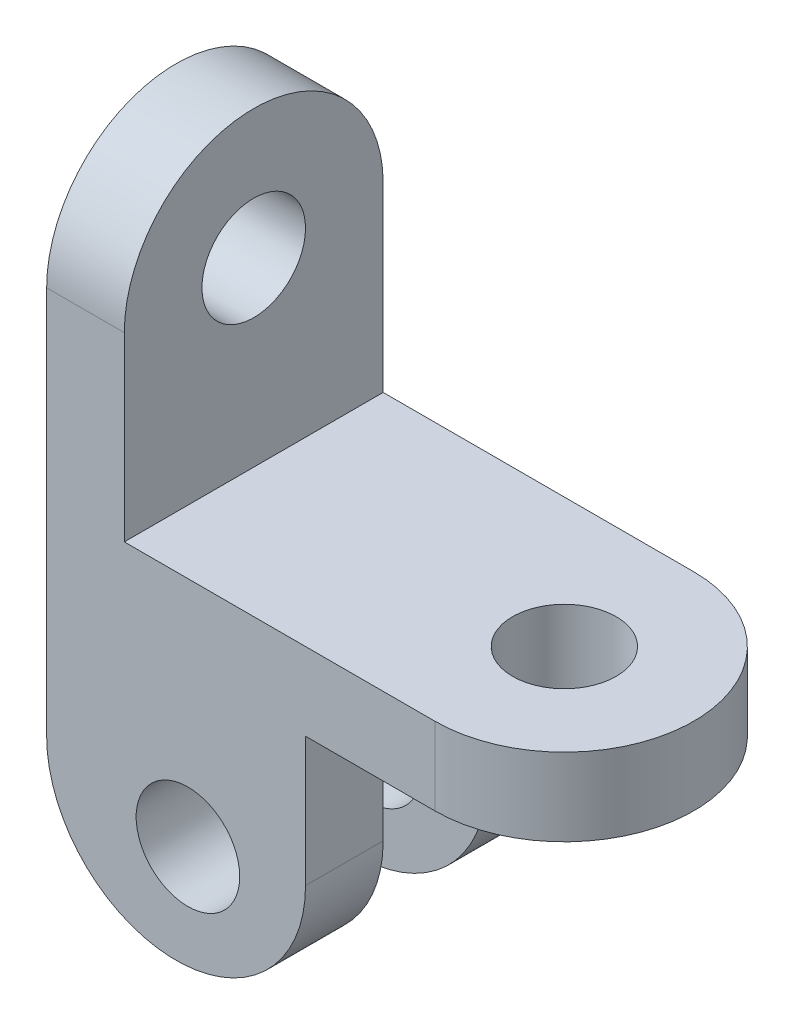
ISO-10303-21;
HEADER;
FILE_DESCRIPTION(('STEP AP214'),'2;1');
FILE_NAME('part.step','',(''),(''),'','','');
FILE_SCHEMA(('AUTOMOTIVE_DESIGN { 1 0 10303 214 1 1 1 1 }'));
ENDSEC;
DATA;
#1=APPLICATION_CONTEXT('core data for automotive mechanical design processes');
#2=APPLICATION_PROTOCOL_DEFINITION('international standard','automotive_design',2000,#1);
#3=PRODUCT_CONTEXT('',#1,'mechanical');
#4=PRODUCT('Part','Part','',(#3));
#5=PRODUCT_RELATED_PRODUCT_CATEGORY('part','',(#4));
#6=PRODUCT_DEFINITION_FORMATION('','',#4);
#7=PRODUCT_DEFINITION_CONTEXT('part definition',#1,'design');
#8=PRODUCT_DEFINITION('design','',#6,#7);
#9=PRODUCT_DEFINITION_SHAPE('','',#8);
#10=(LENGTH_UNIT() NAMED_UNIT(*) SI_UNIT(.MILLI.,.METRE.));
#11=(NAMED_UNIT(*) PLANE_ANGLE_UNIT() SI_UNIT($,.RADIAN.));
#12=(NAMED_UNIT(*) SI_UNIT($,.STERADIAN.) SOLID_ANGLE_UNIT());
#13=UNCERTAINTY_MEASURE_WITH_UNIT(LENGTH_MEASURE(1.E-05),#10,'distance_accuracy_value','');
#14=(GEOMETRIC_REPRESENTATION_CONTEXT(3) GLOBAL_UNCERTAINTY_ASSIGNED_CONTEXT((#13)) GLOBAL_UNIT_ASSIGNED_CONTEXT((#10,
#11,#12)) REPRESENTATION_CONTEXT('',''));
#15=CARTESIAN_POINT('',(0.,0.,0.));
#16=DIRECTION('',(0.,0.,1.));
#17=DIRECTION('',(1.,0.,0.));
#18=AXIS2_PLACEMENT_3D('',#15,#16,#17);
#19=CARTESIAN_POINT('',(0.,0.,0.));
#20=DIRECTION('',(0.,1.,0.));
#21=DIRECTION('',(0.,0.,1.));
#22=AXIS2_PLACEMENT_3D('',#19,#20,#21);
#23=PLANE('',#22);
#24=CARTESIAN_POINT('',(0.,0.,0.));
#25=DIRECTION('',(0.,1.,0.));
#26=DIRECTION('',(0.,0.,1.));
#27=AXIS2_PLACEMENT_3D('',#24,#25,#26);
#28=CIRCLE('',#27,8.);
#29=CARTESIAN_POINT('',(0.,0.,8.));
#30=VERTEX_POINT('',#29);
#31=EDGE_CURVE('E210',#30,#30,#28,.T.);
#32=ORIENTED_EDGE('',*,*,#31,.T.);
#33=EDGE_LOOP('',(#32));
#34=FACE_BOUND('',#33,.T.);
#35=DIRECTION('',(-1.,0.,0.));
#36=VECTOR('',#35,1.);
#37=CARTESIAN_POINT('',(-60.,0.,-8.));
#38=LINE('',#37,#36);
#39=CARTESIAN_POINT('',(-20.,0.,-8.));
#40=VERTEX_POINT('',#39);
#41=CARTESIAN_POINT('',(-60.,0.,-8.));
#42=VERTEX_POINT('',#41);
#43=EDGE_CURVE('E49',#40,#42,#38,.T.);
#44=ORIENTED_EDGE('',*,*,#43,.F.);
#45=DIRECTION('',(0.,0.,1.));
#46=VECTOR('',#45,1.);
#47=CARTESIAN_POINT('',(-20.,0.,-20.));
#48=LINE('',#47,#46);
#49=CARTESIAN_POINT('',(-20.,0.,-20.));
#50=VERTEX_POINT('',#49);
#51=EDGE_CURVE('E159',#50,#40,#48,.T.);
#52=ORIENTED_EDGE('',*,*,#51,.F.);
#53=DIRECTION('',(-1.,0.,0.));
#54=VECTOR('',#53,1.);
#55=CARTESIAN_POINT('',(0.,0.,-20.));
#56=LINE('',#55,#54);
#57=CARTESIAN_POINT('',(0.,0.,-20.));
#58=VERTEX_POINT('',#57);
#59=EDGE_CURVE('E228',#58,#50,#56,.T.);
#60=ORIENTED_EDGE('',*,*,#59,.F.);
#61=CARTESIAN_POINT('',(0.,0.,0.));
#62=DIRECTION('',(0.,1.,0.));
#63=DIRECTION('',(0.,0.,1.));
#64=AXIS2_PLACEMENT_3D('',#61,#62,#63);
#65=CIRCLE('',#64,20.);
#66=CARTESIAN_POINT('',(0.,0.,20.));
#67=VERTEX_POINT('',#66);
#68=EDGE_CURVE('E213',#67,#58,#65,.T.);
#69=ORIENTED_EDGE('',*,*,#68,.F.);
#70=DIRECTION('',(1.,0.,0.));
#71=VECTOR('',#70,1.);
#72=CARTESIAN_POINT('',(0.,0.,20.));
#73=LINE('',#72,#71);
#74=CARTESIAN_POINT('',(-20.,0.,20.));
#75=VERTEX_POINT('',#74);
#76=EDGE_CURVE('E220',#75,#67,#73,.T.);
#77=ORIENTED_EDGE('',*,*,#76,.F.);
#78=DIRECTION('',(0.,0.,1.));
#79=VECTOR('',#78,1.);
#80=CARTESIAN_POINT('',(-20.,0.,8.));
#81=LINE('',#80,#79);
#82=CARTESIAN_POINT('',(-20.,0.,8.));
#83=VERTEX_POINT('',#82);
#84=EDGE_CURVE('E179',#83,#75,#81,.T.);
#85=ORIENTED_EDGE('',*,*,#84,.F.);
#86=DIRECTION('',(-1.,0.,0.));
#87=VECTOR('',#86,1.);
#88=CARTESIAN_POINT('',(-60.,0.,8.));
#89=LINE('',#88,#87);
#90=CARTESIAN_POINT('',(-60.,0.,8.));
#91=VERTEX_POINT('',#90);
#92=EDGE_CURVE('E171',#83,#91,#89,.T.);
#93=ORIENTED_EDGE('',*,*,#92,.T.);
#94=DIRECTION('',(0.,0.,1.));
#95=VECTOR('',#94,1.);
#96=CARTESIAN_POINT('',(-60.,0.,-20.));
#97=LINE('',#96,#95);
#98=EDGE_CURVE('E56',#42,#91,#97,.T.);
#99=ORIENTED_EDGE('',*,*,#98,.F.);
#100=EDGE_LOOP('',(#44,#52,#60,#69,#77,#85,#93,#99));
#101=FACE_BOUND('',#100,.T.);
#102=ADVANCED_FACE('F33',(#34,#101),#23,.F.);
#103=CARTESIAN_POINT('',(0.,12.,0.));
#104=DIRECTION('',(0.,1.,0.));
#105=DIRECTION('',(0.,0.,1.));
#106=AXIS2_PLACEMENT_3D('',#103,#104,#105);
#107=PLANE('',#106);
#108=CARTESIAN_POINT('',(0.,12.,0.));
#109=DIRECTION('',(0.,1.,0.));
#110=DIRECTION('',(0.,0.,1.));
#111=AXIS2_PLACEMENT_3D('',#108,#109,#110);
#112=CIRCLE('',#111,8.);
#113=CARTESIAN_POINT('',(0.,12.,8.));
#114=VERTEX_POINT('',#113);
#115=EDGE_CURVE('E207',#114,#114,#112,.T.);
#116=ORIENTED_EDGE('',*,*,#115,.F.);
#117=EDGE_LOOP('',(#116));
#118=FACE_BOUND('',#117,.T.);
#119=DIRECTION('',(-1.,0.,0.));
#120=VECTOR('',#119,1.);
#121=CARTESIAN_POINT('',(0.,12.,-20.));
#122=LINE('',#121,#120);
#123=CARTESIAN_POINT('',(0.,12.,-20.));
#124=VERTEX_POINT('',#123);
#125=CARTESIAN_POINT('',(-48.,12.,-20.));
#126=VERTEX_POINT('',#125);
#127=EDGE_CURVE('E219',#124,#126,#122,.T.);
#128=ORIENTED_EDGE('',*,*,#127,.T.);
#129=DIRECTION('',(0.,0.,1.));
#130=VECTOR('',#129,1.);
#131=CARTESIAN_POINT('',(-48.,12.,-20.));
#132=LINE('',#131,#130);
#133=CARTESIAN_POINT('',(-48.,12.,20.));
#134=VERTEX_POINT('',#133);
#135=EDGE_CURVE('E194',#126,#134,#132,.T.);
#136=ORIENTED_EDGE('',*,*,#135,.T.);
#137=DIRECTION('',(1.,0.,0.));
#138=VECTOR('',#137,1.);
#139=CARTESIAN_POINT('',(0.,12.,20.));
#140=LINE('',#139,#138);
#141=CARTESIAN_POINT('',(0.,12.,20.));
#142=VERTEX_POINT('',#141);
#143=EDGE_CURVE('E223',#134,#142,#140,.T.);
#144=ORIENTED_EDGE('',*,*,#143,.T.);
#145=CARTESIAN_POINT('',(0.,12.,0.));
#146=DIRECTION('',(0.,1.,0.));
#147=DIRECTION('',(0.,0.,1.));
#148=AXIS2_PLACEMENT_3D('',#145,#146,#147);
#149=CIRCLE('',#148,20.);
#150=EDGE_CURVE('E216',#142,#124,#149,.T.);
#151=ORIENTED_EDGE('',*,*,#150,.T.);
#152=EDGE_LOOP('',(#128,#136,#144,#151));
#153=FACE_BOUND('',#152,.T.);
#154=ADVANCED_FACE('F256',(#118,#153),#107,.T.);
#155=CARTESIAN_POINT('',(0.,12.,0.));
#156=DIRECTION('',(0.,-1.,0.));
#157=DIRECTION('',(0.,0.,-1.));
#158=AXIS2_PLACEMENT_3D('',#155,#156,#157);
#159=CYLINDRICAL_SURFACE('',#158,20.);
#160=ORIENTED_EDGE('',*,*,#68,.T.);
#161=DIRECTION('',(0.,-1.,0.));
#162=VECTOR('',#161,1.);
#163=CARTESIAN_POINT('',(0.,12.,-20.));
#164=LINE('',#163,#162);
#165=EDGE_CURVE('E11',#124,#58,#164,.T.);
#166=ORIENTED_EDGE('',*,*,#165,.F.);
#167=ORIENTED_EDGE('',*,*,#150,.F.);
#168=DIRECTION('',(0.,-1.,0.));
#169=VECTOR('',#168,1.);
#170=CARTESIAN_POINT('',(0.,12.,20.));
#171=LINE('',#170,#169);
#172=EDGE_CURVE('E225',#142,#67,#171,.T.);
#173=ORIENTED_EDGE('',*,*,#172,.T.);
#174=EDGE_LOOP('',(#160,#166,#167,#173));
#175=FACE_BOUND('',#174,.T.);
#176=ADVANCED_FACE('F35',(#175),#159,.T.);
#177=CARTESIAN_POINT('',(0.,12.,-20.));
#178=DIRECTION('',(0.,0.,1.));
#179=DIRECTION('',(1.,0.,0.));
#180=AXIS2_PLACEMENT_3D('',#177,#178,#179);
#181=PLANE('',#180);
#182=CARTESIAN_POINT('',(-38.1692293499623,-23.8807713065157,-20.));
#183=DIRECTION('',(0.,0.,1.));
#184=DIRECTION('',(1.,0.,0.));
#185=AXIS2_PLACEMENT_3D('',#182,#183,#184);
#186=CIRCLE('',#185,8.);
#187=CARTESIAN_POINT('',(-30.1692293499623,-23.8807713065157,-20.));
#188=VERTEX_POINT('',#187);
#189=EDGE_CURVE('E295',#188,#188,#186,.T.);
#190=ORIENTED_EDGE('',*,*,#189,.T.);
#191=EDGE_LOOP('',(#190));
#192=FACE_BOUND('',#191,.T.);
#193=ORIENTED_EDGE('',*,*,#59,.T.);
#194=DIRECTION('',(0.,1.,0.));
#195=VECTOR('',#194,1.);
#196=CARTESIAN_POINT('',(-20.,0.,-20.));
#197=LINE('',#196,#195);
#198=CARTESIAN_POINT('',(-20.,-20.,-20.));
#199=VERTEX_POINT('',#198);
#200=EDGE_CURVE('E142',#199,#50,#197,.T.);
#201=ORIENTED_EDGE('',*,*,#200,.F.);
#202=CARTESIAN_POINT('',(-40.,-20.,-20.));
#203=DIRECTION('',(0.,0.,1.));
#204=DIRECTION('',(1.,0.,0.));
#205=AXIS2_PLACEMENT_3D('',#202,#203,#204);
#206=CIRCLE('',#205,20.);
#207=CARTESIAN_POINT('',(-60.,-20.,-20.));
#208=VERTEX_POINT('',#207);
#209=EDGE_CURVE('E138',#208,#199,#206,.T.);
#210=ORIENTED_EDGE('',*,*,#209,.F.);
#211=DIRECTION('',(0.,-1.,0.));
#212=VECTOR('',#211,1.);
#213=CARTESIAN_POINT('',(-60.,12.,-20.));
#214=LINE('',#213,#212);
#215=CARTESIAN_POINT('',(-60.,40.,-20.));
#216=VERTEX_POINT('',#215);
#217=EDGE_CURVE('E42',#216,#208,#214,.T.);
#218=ORIENTED_EDGE('',*,*,#217,.F.);
#219=DIRECTION('',(-1.,0.,0.));
#220=VECTOR('',#219,1.);
#221=CARTESIAN_POINT('',(-48.,40.,-20.));
#222=LINE('',#221,#220);
#223=CARTESIAN_POINT('',(-48.,40.,-20.));
#224=VERTEX_POINT('',#223);
#225=EDGE_CURVE('E205',#224,#216,#222,.T.);
#226=ORIENTED_EDGE('',*,*,#225,.F.);
#227=DIRECTION('',(0.,-1.,0.));
#228=VECTOR('',#227,1.);
#229=CARTESIAN_POINT('',(-48.,12.,-20.));
#230=LINE('',#229,#228);
#231=EDGE_CURVE('E191',#224,#126,#230,.T.);
#232=ORIENTED_EDGE('',*,*,#231,.T.);
#233=ORIENTED_EDGE('',*,*,#127,.F.);
#234=ORIENTED_EDGE('',*,*,#165,.T.);
#235=EDGE_LOOP('',(#193,#201,#210,#218,#226,#232,#233,#234));
#236=FACE_BOUND('',#235,.T.);
#237=ADVANCED_FACE('F146',(#192,#236),#181,.F.);
#238=CARTESIAN_POINT('',(-60.,12.,-20.));
#239=DIRECTION('',(1.,0.,0.));
#240=DIRECTION('',(0.,0.,-1.));
#241=AXIS2_PLACEMENT_3D('',#238,#239,#240);
#242=PLANE('',#241);
#243=CARTESIAN_POINT('',(-60.,40.,0.));
#244=DIRECTION('',(1.,0.,0.));
#245=DIRECTION('',(0.,0.,-1.));
#246=AXIS2_PLACEMENT_3D('',#243,#244,#245);
#247=CIRCLE('',#246,8.);
#248=CARTESIAN_POINT('',(-60.,40.,-8.));
#249=VERTEX_POINT('',#248);
#250=EDGE_CURVE('E186',#249,#249,#247,.T.);
#251=ORIENTED_EDGE('',*,*,#250,.T.);
#252=EDGE_LOOP('',(#251));
#253=FACE_BOUND('',#252,.T.);
#254=ORIENTED_EDGE('',*,*,#217,.T.);
#255=DIRECTION('',(0.,0.,1.));
#256=VECTOR('',#255,1.);
#257=CARTESIAN_POINT('',(-60.,-20.,-20.));
#258=LINE('',#257,#256);
#259=CARTESIAN_POINT('',(-60.,-20.,-8.));
#260=VERTEX_POINT('',#259);
#261=EDGE_CURVE('E126',#208,#260,#258,.T.);
#262=ORIENTED_EDGE('',*,*,#261,.T.);
#263=DIRECTION('',(0.,-1.,0.));
#264=VECTOR('',#263,1.);
#265=CARTESIAN_POINT('',(-60.,0.,-8.));
#266=LINE('',#265,#264);
#267=EDGE_CURVE('E155',#42,#260,#266,.T.);
#268=ORIENTED_EDGE('',*,*,#267,.F.);
#269=ORIENTED_EDGE('',*,*,#98,.T.);
#270=DIRECTION('',(0.,-1.,0.));
#271=VECTOR('',#270,1.);
#272=CARTESIAN_POINT('',(-60.,0.,8.));
#273=LINE('',#272,#271);
#274=CARTESIAN_POINT('',(-60.,-20.,8.));
#275=VERTEX_POINT('',#274);
#276=EDGE_CURVE('E163',#91,#275,#273,.T.);
#277=ORIENTED_EDGE('',*,*,#276,.T.);
#278=DIRECTION('',(0.,0.,1.));
#279=VECTOR('',#278,1.);
#280=CARTESIAN_POINT('',(-60.,-20.,8.));
#281=LINE('',#280,#279);
#282=CARTESIAN_POINT('',(-60.,-20.,20.));
#283=VERTEX_POINT('',#282);
#284=EDGE_CURVE('E174',#275,#283,#281,.T.);
#285=ORIENTED_EDGE('',*,*,#284,.T.);
#286=DIRECTION('',(0.,-1.,0.));
#287=VECTOR('',#286,1.);
#288=CARTESIAN_POINT('',(-60.,12.,20.));
#289=LINE('',#288,#287);
#290=CARTESIAN_POINT('',(-60.,40.,20.));
#291=VERTEX_POINT('',#290);
#292=EDGE_CURVE('E133',#291,#283,#289,.T.);
#293=ORIENTED_EDGE('',*,*,#292,.F.);
#294=CARTESIAN_POINT('',(-60.,40.,0.));
#295=DIRECTION('',(-1.,0.,0.));
#296=DIRECTION('',(0.,0.,1.));
#297=AXIS2_PLACEMENT_3D('',#294,#295,#296);
#298=CIRCLE('',#297,20.);
#299=EDGE_CURVE('E129',#291,#216,#298,.T.);
#300=ORIENTED_EDGE('',*,*,#299,.T.);
#301=EDGE_LOOP('',(#254,#262,#268,#269,#277,#285,#293,#300));
#302=FACE_BOUND('',#301,.T.);
#303=ADVANCED_FACE('F125',(#253,#302),#242,.F.);
#304=CARTESIAN_POINT('',(0.,12.,20.));
#305=DIRECTION('',(0.,0.,-1.));
#306=DIRECTION('',(-1.,0.,0.));
#307=AXIS2_PLACEMENT_3D('',#304,#305,#306);
#308=PLANE('',#307);
#309=CARTESIAN_POINT('',(-38.1692293499623,-23.8807713065157,20.));
#310=DIRECTION('',(0.,0.,1.));
#311=DIRECTION('',(1.,0.,0.));
#312=AXIS2_PLACEMENT_3D('',#309,#310,#311);
#313=CIRCLE('',#312,8.);
#314=CARTESIAN_POINT('',(-30.1692293499623,-23.8807713065157,20.));
#315=VERTEX_POINT('',#314);
#316=EDGE_CURVE('E297',#315,#315,#313,.T.);
#317=ORIENTED_EDGE('',*,*,#316,.F.);
#318=EDGE_LOOP('',(#317));
#319=FACE_BOUND('',#318,.T.);
#320=ORIENTED_EDGE('',*,*,#292,.T.);
#321=CARTESIAN_POINT('',(-40.,-20.,20.));
#322=DIRECTION('',(0.,0.,1.));
#323=DIRECTION('',(1.,0.,0.));
#324=AXIS2_PLACEMENT_3D('',#321,#322,#323);
#325=CIRCLE('',#324,20.);
#326=CARTESIAN_POINT('',(-20.,-20.,20.));
#327=VERTEX_POINT('',#326);
#328=EDGE_CURVE('E161',#283,#327,#325,.T.);
#329=ORIENTED_EDGE('',*,*,#328,.T.);
#330=DIRECTION('',(0.,1.,0.));
#331=VECTOR('',#330,1.);
#332=CARTESIAN_POINT('',(-20.,0.,20.));
#333=LINE('',#332,#331);
#334=EDGE_CURVE('E166',#327,#75,#333,.T.);
#335=ORIENTED_EDGE('',*,*,#334,.T.);
#336=ORIENTED_EDGE('',*,*,#76,.T.);
#337=ORIENTED_EDGE('',*,*,#172,.F.);
#338=ORIENTED_EDGE('',*,*,#143,.F.);
#339=DIRECTION('',(0.,1.,0.));
#340=VECTOR('',#339,1.);
#341=CARTESIAN_POINT('',(-48.,12.,20.));
#342=LINE('',#341,#340);
#343=CARTESIAN_POINT('',(-48.,40.,20.));
#344=VERTEX_POINT('',#343);
#345=EDGE_CURVE('E197',#134,#344,#342,.T.);
#346=ORIENTED_EDGE('',*,*,#345,.T.);
#347=DIRECTION('',(-1.,0.,0.));
#348=VECTOR('',#347,1.);
#349=CARTESIAN_POINT('',(-48.,40.,20.));
#350=LINE('',#349,#348);
#351=EDGE_CURVE('E203',#344,#291,#350,.T.);
#352=ORIENTED_EDGE('',*,*,#351,.T.);
#353=EDGE_LOOP('',(#320,#329,#335,#336,#337,#338,#346,#352));
#354=FACE_BOUND('',#353,.T.);
#355=ADVANCED_FACE('F235',(#319,#354),#308,.F.);
#356=CARTESIAN_POINT('',(0.,0.,0.));
#357=DIRECTION('',(0.,1.,0.));
#358=DIRECTION('',(0.,0.,1.));
#359=AXIS2_PLACEMENT_3D('',#356,#357,#358);
#360=CYLINDRICAL_SURFACE('',#359,8.);
#361=ORIENTED_EDGE('',*,*,#31,.F.);
#362=EDGE_LOOP('',(#361));
#363=FACE_BOUND('',#362,.T.);
#364=ORIENTED_EDGE('',*,*,#115,.T.);
#365=EDGE_LOOP('',(#364));
#366=FACE_BOUND('',#365,.T.);
#367=ADVANCED_FACE('F263',(#363,#366),#360,.F.);
#368=CARTESIAN_POINT('',(-48.,40.,0.));
#369=DIRECTION('',(-1.,0.,0.));
#370=DIRECTION('',(0.,0.,1.));
#371=AXIS2_PLACEMENT_3D('',#368,#369,#370);
#372=CYLINDRICAL_SURFACE('',#371,20.);
#373=ORIENTED_EDGE('',*,*,#299,.F.);
#374=ORIENTED_EDGE('',*,*,#351,.F.);
#375=CARTESIAN_POINT('',(-48.,40.,0.));
#376=DIRECTION('',(-1.,0.,0.));
#377=DIRECTION('',(0.,0.,1.));
#378=AXIS2_PLACEMENT_3D('',#375,#376,#377);
#379=CIRCLE('',#378,20.);
#380=EDGE_CURVE('E200',#344,#224,#379,.T.);
#381=ORIENTED_EDGE('',*,*,#380,.T.);
#382=ORIENTED_EDGE('',*,*,#225,.T.);
#383=EDGE_LOOP('',(#373,#374,#381,#382));
#384=FACE_BOUND('',#383,.T.);
#385=ADVANCED_FACE('F261',(#384),#372,.T.);
#386=CARTESIAN_POINT('',(-48.,40.,0.));
#387=DIRECTION('',(-1.,0.,0.));
#388=DIRECTION('',(0.,0.,1.));
#389=AXIS2_PLACEMENT_3D('',#386,#387,#388);
#390=PLANE('',#389);
#391=CARTESIAN_POINT('',(-48.,40.,0.));
#392=DIRECTION('',(1.,0.,0.));
#393=DIRECTION('',(0.,0.,-1.));
#394=AXIS2_PLACEMENT_3D('',#391,#392,#393);
#395=CIRCLE('',#394,8.);
#396=CARTESIAN_POINT('',(-48.,40.,-8.));
#397=VERTEX_POINT('',#396);
#398=EDGE_CURVE('E181',#397,#397,#395,.T.);
#399=ORIENTED_EDGE('',*,*,#398,.F.);
#400=EDGE_LOOP('',(#399));
#401=FACE_BOUND('',#400,.T.);
#402=ORIENTED_EDGE('',*,*,#231,.F.);
#403=ORIENTED_EDGE('',*,*,#380,.F.);
#404=ORIENTED_EDGE('',*,*,#345,.F.);
#405=ORIENTED_EDGE('',*,*,#135,.F.);
#406=EDGE_LOOP('',(#402,#403,#404,#405));
#407=FACE_BOUND('',#406,.T.);
#408=ADVANCED_FACE('F259',(#401,#407),#390,.F.);
#409=CARTESIAN_POINT('',(-60.,40.,0.));
#410=DIRECTION('',(1.,0.,0.));
#411=DIRECTION('',(0.,0.,-1.));
#412=AXIS2_PLACEMENT_3D('',#409,#410,#411);
#413=CYLINDRICAL_SURFACE('',#412,8.);
#414=ORIENTED_EDGE('',*,*,#250,.F.);
#415=EDGE_LOOP('',(#414));
#416=FACE_BOUND('',#415,.T.);
#417=ORIENTED_EDGE('',*,*,#398,.T.);
#418=EDGE_LOOP('',(#417));
#419=FACE_BOUND('',#418,.T.);
#420=ADVANCED_FACE('F269',(#416,#419),#413,.F.);
#421=CARTESIAN_POINT('',(-20.,0.,8.));
#422=DIRECTION('',(1.,0.,0.));
#423=DIRECTION('',(0.,1.,0.));
#424=AXIS2_PLACEMENT_3D('',#421,#422,#423);
#425=PLANE('',#424);
#426=ORIENTED_EDGE('',*,*,#334,.F.);
#427=DIRECTION('',(0.,0.,1.));
#428=VECTOR('',#427,1.);
#429=CARTESIAN_POINT('',(-20.,-20.,8.));
#430=LINE('',#429,#428);
#431=CARTESIAN_POINT('',(-20.,-20.,8.));
#432=VERTEX_POINT('',#431);
#433=EDGE_CURVE('E182',#432,#327,#430,.T.);
#434=ORIENTED_EDGE('',*,*,#433,.F.);
#435=DIRECTION('',(0.,1.,0.));
#436=VECTOR('',#435,1.);
#437=CARTESIAN_POINT('',(-20.,0.,8.));
#438=LINE('',#437,#436);
#439=EDGE_CURVE('E169',#432,#83,#438,.T.);
#440=ORIENTED_EDGE('',*,*,#439,.T.);
#441=ORIENTED_EDGE('',*,*,#84,.T.);
#442=EDGE_LOOP('',(#426,#434,#440,#441));
#443=FACE_BOUND('',#442,.T.);
#444=ADVANCED_FACE('F243',(#443),#425,.T.);
#445=CARTESIAN_POINT('',(-40.,-20.,8.));
#446=DIRECTION('',(0.,0.,1.));
#447=DIRECTION('',(1.,0.,0.));
#448=AXIS2_PLACEMENT_3D('',#445,#446,#447);
#449=CYLINDRICAL_SURFACE('',#448,20.);
#450=ORIENTED_EDGE('',*,*,#328,.F.);
#451=ORIENTED_EDGE('',*,*,#284,.F.);
#452=CARTESIAN_POINT('',(-40.,-20.,8.));
#453=DIRECTION('',(0.,0.,1.));
#454=DIRECTION('',(1.,0.,0.));
#455=AXIS2_PLACEMENT_3D('',#452,#453,#454);
#456=CIRCLE('',#455,20.);
#457=EDGE_CURVE('E165',#275,#432,#456,.T.);
#458=ORIENTED_EDGE('',*,*,#457,.T.);
#459=ORIENTED_EDGE('',*,*,#433,.T.);
#460=EDGE_LOOP('',(#450,#451,#458,#459));
#461=FACE_BOUND('',#460,.T.);
#462=ADVANCED_FACE('F239',(#461),#449,.T.);
#463=CARTESIAN_POINT('',(-40.,-20.,8.));
#464=DIRECTION('',(0.,0.,1.));
#465=DIRECTION('',(1.,0.,0.));
#466=AXIS2_PLACEMENT_3D('',#463,#464,#465);
#467=PLANE('',#466);
#468=CARTESIAN_POINT('',(-38.1692293499623,-23.8807713065157,8.));
#469=DIRECTION('',(0.,0.,1.));
#470=DIRECTION('',(1.,0.,0.));
#471=AXIS2_PLACEMENT_3D('',#468,#469,#470);
#472=CIRCLE('',#471,8.);
#473=CARTESIAN_POINT('',(-30.1692293499623,-23.8807713065157,8.));
#474=VERTEX_POINT('',#473);
#475=EDGE_CURVE('E152',#474,#474,#472,.T.);
#476=ORIENTED_EDGE('',*,*,#475,.T.);
#477=EDGE_LOOP('',(#476));
#478=FACE_BOUND('',#477,.T.);
#479=ORIENTED_EDGE('',*,*,#276,.F.);
#480=ORIENTED_EDGE('',*,*,#92,.F.);
#481=ORIENTED_EDGE('',*,*,#439,.F.);
#482=ORIENTED_EDGE('',*,*,#457,.F.);
#483=EDGE_LOOP('',(#479,#480,#481,#482));
#484=FACE_BOUND('',#483,.T.);
#485=ADVANCED_FACE('F311',(#478,#484),#467,.F.);
#486=CARTESIAN_POINT('',(-20.,0.,-20.));
#487=DIRECTION('',(1.,0.,0.));
#488=DIRECTION('',(0.,1.,0.));
#489=AXIS2_PLACEMENT_3D('',#486,#487,#488);
#490=PLANE('',#489);
#491=DIRECTION('',(0.,1.,0.));
#492=VECTOR('',#491,1.);
#493=CARTESIAN_POINT('',(-20.,0.,-8.));
#494=LINE('',#493,#492);
#495=CARTESIAN_POINT('',(-20.,-20.,-8.));
#496=VERTEX_POINT('',#495);
#497=EDGE_CURVE('E149',#496,#40,#494,.T.);
#498=ORIENTED_EDGE('',*,*,#497,.F.);
#499=DIRECTION('',(0.,0.,1.));
#500=VECTOR('',#499,1.);
#501=CARTESIAN_POINT('',(-20.,-20.,-20.));
#502=LINE('',#501,#500);
#503=EDGE_CURVE('E141',#199,#496,#502,.T.);
#504=ORIENTED_EDGE('',*,*,#503,.F.);
#505=ORIENTED_EDGE('',*,*,#200,.T.);
#506=ORIENTED_EDGE('',*,*,#51,.T.);
#507=EDGE_LOOP('',(#498,#504,#505,#506));
#508=FACE_BOUND('',#507,.T.);
#509=ADVANCED_FACE('F314',(#508),#490,.T.);
#510=CARTESIAN_POINT('',(-40.,-20.,-20.));
#511=DIRECTION('',(0.,0.,1.));
#512=DIRECTION('',(1.,0.,0.));
#513=AXIS2_PLACEMENT_3D('',#510,#511,#512);
#514=CYLINDRICAL_SURFACE('',#513,20.);
#515=CARTESIAN_POINT('',(-40.,-20.,-8.));
#516=DIRECTION('',(0.,0.,1.));
#517=DIRECTION('',(1.,0.,0.));
#518=AXIS2_PLACEMENT_3D('',#515,#516,#517);
#519=CIRCLE('',#518,20.);
#520=EDGE_CURVE('E140',#260,#496,#519,.T.);
#521=ORIENTED_EDGE('',*,*,#520,.F.);
#522=ORIENTED_EDGE('',*,*,#261,.F.);
#523=ORIENTED_EDGE('',*,*,#209,.T.);
#524=ORIENTED_EDGE('',*,*,#503,.T.);
#525=EDGE_LOOP('',(#521,#522,#523,#524));
#526=FACE_BOUND('',#525,.T.);
#527=ADVANCED_FACE('F137',(#526),#514,.T.);
#528=CARTESIAN_POINT('',(-40.,-20.,-8.));
#529=DIRECTION('',(0.,0.,1.));
#530=DIRECTION('',(1.,0.,0.));
#531=AXIS2_PLACEMENT_3D('',#528,#529,#530);
#532=PLANE('',#531);
#533=CARTESIAN_POINT('',(-38.1692293499623,-23.8807713065157,-8.));
#534=DIRECTION('',(0.,0.,1.));
#535=DIRECTION('',(1.,0.,0.));
#536=AXIS2_PLACEMENT_3D('',#533,#534,#535);
#537=CIRCLE('',#536,8.);
#538=CARTESIAN_POINT('',(-30.1692293499623,-23.8807713065157,-8.));
#539=VERTEX_POINT('',#538);
#540=EDGE_CURVE('E37',#539,#539,#537,.T.);
#541=ORIENTED_EDGE('',*,*,#540,.F.);
#542=EDGE_LOOP('',(#541));
#543=FACE_BOUND('',#542,.T.);
#544=ORIENTED_EDGE('',*,*,#267,.T.);
#545=ORIENTED_EDGE('',*,*,#520,.T.);
#546=ORIENTED_EDGE('',*,*,#497,.T.);
#547=ORIENTED_EDGE('',*,*,#43,.T.);
#548=EDGE_LOOP('',(#544,#545,#546,#547));
#549=FACE_BOUND('',#548,.T.);
#550=ADVANCED_FACE('F319',(#543,#549),#532,.T.);
#551=CARTESIAN_POINT('',(-38.1692293499623,-23.8807713065157,-20.));
#552=DIRECTION('',(0.,0.,1.));
#553=DIRECTION('',(1.,0.,0.));
#554=AXIS2_PLACEMENT_3D('',#551,#552,#553);
#555=CYLINDRICAL_SURFACE('',#554,8.);
#556=ORIENTED_EDGE('',*,*,#540,.T.);
#557=EDGE_LOOP('',(#556));
#558=FACE_BOUND('',#557,.T.);
#559=ORIENTED_EDGE('',*,*,#189,.F.);
#560=EDGE_LOOP('',(#559));
#561=FACE_BOUND('',#560,.T.);
#562=ADVANCED_FACE('F306',(#558,#561),#555,.F.);
#563=ORIENTED_EDGE('',*,*,#316,.T.);
#564=EDGE_LOOP('',(#563));
#565=FACE_BOUND('',#564,.T.);
#566=ORIENTED_EDGE('',*,*,#475,.F.);
#567=EDGE_LOOP('',(#566));
#568=FACE_BOUND('',#567,.T.);
#569=ADVANCED_FACE('F303',(#565,#568),#555,.F.);
#570=CLOSED_SHELL('',(#102,#154,#176,#237,#303,#355,#367,#385,#408,#420,#444,#462,#485,#509,
#527,#550,#562,#569));
#571=MANIFOLD_SOLID_BREP('B2',#570);
#572=ADVANCED_BREP_SHAPE_REPRESENTATION('',(#18,#571),#14);
#573=SHAPE_DEFINITION_REPRESENTATION(#9,#572);
ENDSEC;
END-ISO-10303-21;
